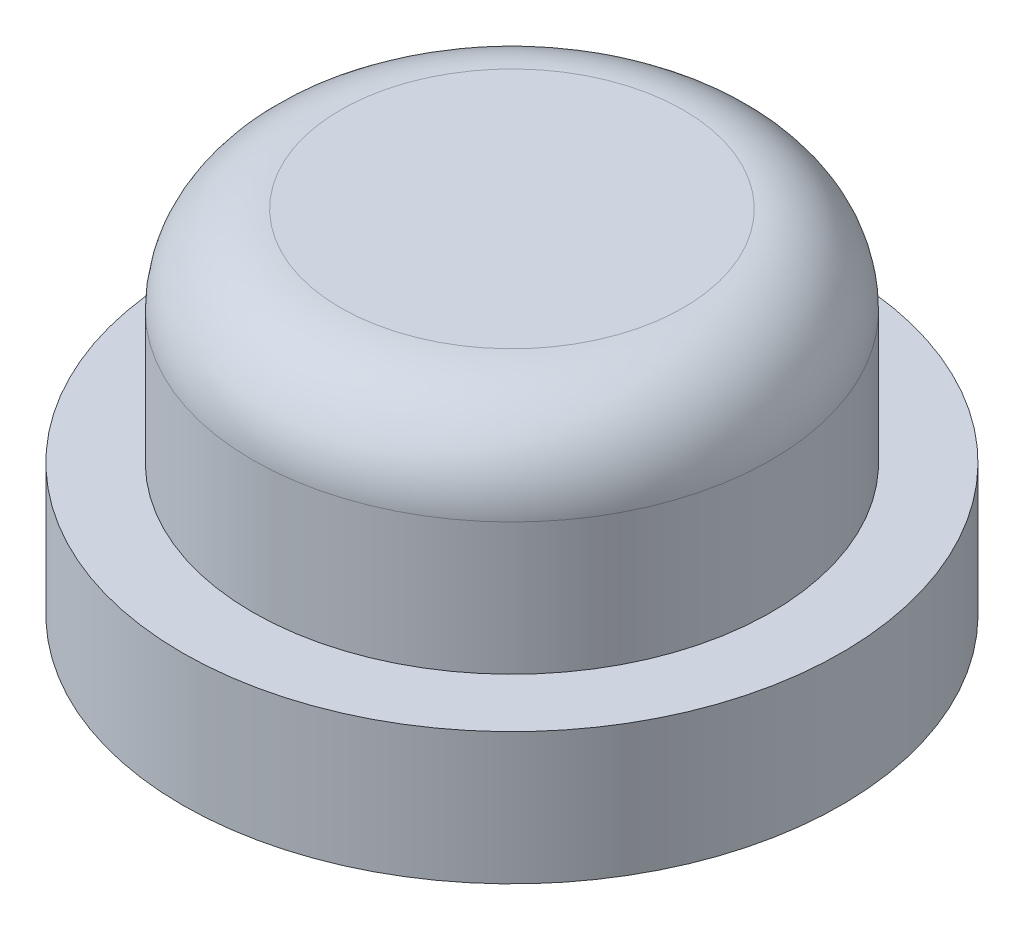
ISO-10303-21;
HEADER;
FILE_DESCRIPTION(('STEP AP214'),'2;1');
FILE_NAME('part.step','',(''),(''),'','','');
FILE_SCHEMA(('AUTOMOTIVE_DESIGN { 1 0 10303 214 1 1 1 1 }'));
ENDSEC;
DATA;
#1=APPLICATION_CONTEXT('core data for automotive mechanical design processes');
#2=APPLICATION_PROTOCOL_DEFINITION('international standard','automotive_design',2000,#1);
#3=PRODUCT_CONTEXT('',#1,'mechanical');
#4=PRODUCT('Part','Part','',(#3));
#5=PRODUCT_RELATED_PRODUCT_CATEGORY('part','',(#4));
#6=PRODUCT_DEFINITION_FORMATION('','',#4);
#7=PRODUCT_DEFINITION_CONTEXT('part definition',#1,'design');
#8=PRODUCT_DEFINITION('design','',#6,#7);
#9=PRODUCT_DEFINITION_SHAPE('','',#8);
#10=(LENGTH_UNIT() NAMED_UNIT(*) SI_UNIT(.MILLI.,.METRE.));
#11=(NAMED_UNIT(*) PLANE_ANGLE_UNIT() SI_UNIT($,.RADIAN.));
#12=(NAMED_UNIT(*) SI_UNIT($,.STERADIAN.) SOLID_ANGLE_UNIT());
#13=UNCERTAINTY_MEASURE_WITH_UNIT(LENGTH_MEASURE(1.E-05),#10,'distance_accuracy_value','');
#14=(GEOMETRIC_REPRESENTATION_CONTEXT(3) GLOBAL_UNCERTAINTY_ASSIGNED_CONTEXT((#13)) GLOBAL_UNIT_ASSIGNED_CONTEXT((#10,
#11,#12)) REPRESENTATION_CONTEXT('',''));
#15=CARTESIAN_POINT('',(0.,0.,0.));
#16=DIRECTION('',(0.,0.,1.));
#17=DIRECTION('',(1.,0.,0.));
#18=AXIS2_PLACEMENT_3D('',#15,#16,#17);
#19=CARTESIAN_POINT('',(0.,1.5,0.));
#20=DIRECTION('',(0.,-1.,0.));
#21=DIRECTION('',(0.,0.,-1.));
#22=AXIS2_PLACEMENT_3D('',#19,#20,#21);
#23=CYLINDRICAL_SURFACE('',#22,3.75);
#24=CARTESIAN_POINT('',(0.,1.5,0.));
#25=DIRECTION('',(0.,1.,0.));
#26=DIRECTION('',(0.,0.,1.));
#27=AXIS2_PLACEMENT_3D('',#24,#25,#26);
#28=CIRCLE('',#27,3.75);
#29=CARTESIAN_POINT('',(0.,1.5,3.75));
#30=VERTEX_POINT('',#29);
#31=EDGE_CURVE('E52',#30,#30,#28,.T.);
#32=ORIENTED_EDGE('',*,*,#31,.F.);
#33=EDGE_LOOP('',(#32));
#34=FACE_BOUND('',#33,.T.);
#35=CARTESIAN_POINT('',(0.,0.,0.));
#36=DIRECTION('',(0.,1.,0.));
#37=DIRECTION('',(0.,0.,1.));
#38=AXIS2_PLACEMENT_3D('',#35,#36,#37);
#39=CIRCLE('',#38,3.75);
#40=CARTESIAN_POINT('',(0.,0.,3.75));
#41=VERTEX_POINT('',#40);
#42=EDGE_CURVE('E55',#41,#41,#39,.T.);
#43=ORIENTED_EDGE('',*,*,#42,.T.);
#44=EDGE_LOOP('',(#43));
#45=FACE_BOUND('',#44,.T.);
#46=ADVANCED_FACE('F37',(#34,#45),#23,.T.);
#47=CARTESIAN_POINT('',(0.,1.5,0.));
#48=DIRECTION('',(0.,1.,0.));
#49=DIRECTION('',(0.,0.,1.));
#50=AXIS2_PLACEMENT_3D('',#47,#48,#49);
#51=PLANE('',#50);
#52=CARTESIAN_POINT('',(0.,1.5,0.));
#53=DIRECTION('',(0.,1.,0.));
#54=DIRECTION('',(0.,0.,1.));
#55=AXIS2_PLACEMENT_3D('',#52,#53,#54);
#56=CIRCLE('',#55,2.95);
#57=CARTESIAN_POINT('',(0.,1.5,2.95));
#58=VERTEX_POINT('',#57);
#59=EDGE_CURVE('E48',#58,#58,#56,.T.);
#60=ORIENTED_EDGE('',*,*,#59,.F.);
#61=EDGE_LOOP('',(#60));
#62=FACE_BOUND('',#61,.T.);
#63=ORIENTED_EDGE('',*,*,#31,.T.);
#64=EDGE_LOOP('',(#63));
#65=FACE_BOUND('',#64,.T.);
#66=ADVANCED_FACE('F61',(#62,#65),#51,.T.);
#67=CARTESIAN_POINT('',(0.,0.,0.));
#68=DIRECTION('',(0.,1.,0.));
#69=DIRECTION('',(0.,0.,1.));
#70=AXIS2_PLACEMENT_3D('',#67,#68,#69);
#71=PLANE('',#70);
#72=ORIENTED_EDGE('',*,*,#42,.F.);
#73=EDGE_LOOP('',(#72));
#74=FACE_BOUND('',#73,.T.);
#75=ADVANCED_FACE('F67',(#74),#71,.F.);
#76=CARTESIAN_POINT('',(0.,4.,0.));
#77=DIRECTION('',(0.,-1.,0.));
#78=DIRECTION('',(0.,0.,-1.));
#79=AXIS2_PLACEMENT_3D('',#76,#77,#78);
#80=CYLINDRICAL_SURFACE('',#79,2.95);
#81=CARTESIAN_POINT('',(0.,3.,0.));
#82=DIRECTION('',(0.,1.,0.));
#83=DIRECTION('',(0.,0.,1.));
#84=AXIS2_PLACEMENT_3D('',#81,#82,#83);
#85=CIRCLE('',#84,2.95);
#86=CARTESIAN_POINT('',(0.,3.,2.95));
#87=VERTEX_POINT('',#86);
#88=EDGE_CURVE('E10',#87,#87,#85,.F.);
#89=ORIENTED_EDGE('',*,*,#88,.T.);
#90=EDGE_LOOP('',(#89));
#91=FACE_BOUND('',#90,.T.);
#92=ORIENTED_EDGE('',*,*,#59,.T.);
#93=EDGE_LOOP('',(#92));
#94=FACE_BOUND('',#93,.T.);
#95=ADVANCED_FACE('F69',(#91,#94),#80,.T.);
#96=CARTESIAN_POINT('',(0.,4.,0.));
#97=DIRECTION('',(0.,1.,0.));
#98=DIRECTION('',(0.,0.,1.));
#99=AXIS2_PLACEMENT_3D('',#96,#97,#98);
#100=PLANE('',#99);
#101=CARTESIAN_POINT('',(0.,4.,0.));
#102=DIRECTION('',(0.,1.,0.));
#103=DIRECTION('',(0.,0.,1.));
#104=AXIS2_PLACEMENT_3D('',#101,#102,#103);
#105=CIRCLE('',#104,1.95);
#106=CARTESIAN_POINT('',(0.,4.,1.95));
#107=VERTEX_POINT('',#106);
#108=EDGE_CURVE('E44',#107,#107,#105,.T.);
#109=ORIENTED_EDGE('',*,*,#108,.T.);
#110=EDGE_LOOP('',(#109));
#111=FACE_BOUND('',#110,.T.);
#112=ADVANCED_FACE('F75',(#111),#100,.T.);
#113=CARTESIAN_POINT('',(0.,3.,0.));
#114=DIRECTION('',(0.,1.,0.));
#115=DIRECTION('',(0.,0.,1.));
#116=AXIS2_PLACEMENT_3D('',#113,#114,#115);
#117=TOROIDAL_SURFACE('',#116,1.95,1.);
#118=ORIENTED_EDGE('',*,*,#88,.F.);
#119=EDGE_LOOP('',(#118));
#120=FACE_BOUND('',#119,.T.);
#121=ORIENTED_EDGE('',*,*,#108,.F.);
#122=EDGE_LOOP('',(#121));
#123=FACE_BOUND('',#122,.T.);
#124=ADVANCED_FACE('F39',(#120,#123),#117,.T.);
#125=CLOSED_SHELL('',(#46,#66,#75,#95,#112,#124));
#126=MANIFOLD_SOLID_BREP('B2',#125);
#127=ADVANCED_BREP_SHAPE_REPRESENTATION('',(#18,#126),#14);
#128=SHAPE_DEFINITION_REPRESENTATION(#9,#127);
ENDSEC;
END-ISO-10303-21;
